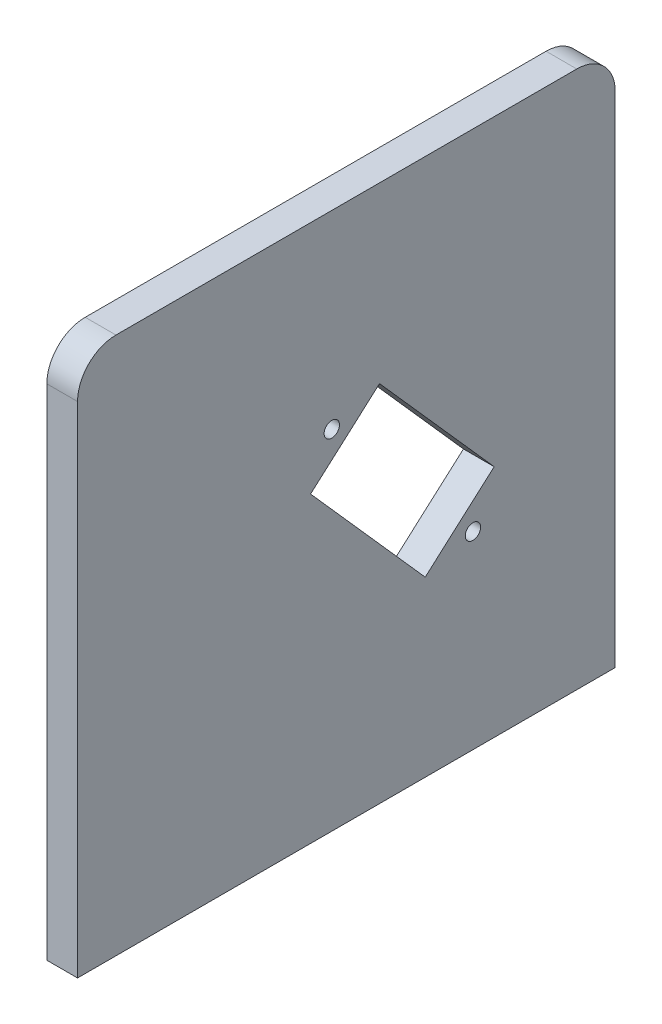
ISO-10303-21;
HEADER;
FILE_DESCRIPTION(('STEP AP214'),'2;1');
FILE_NAME('part.step','',(''),(''),'','','');
FILE_SCHEMA(('AUTOMOTIVE_DESIGN { 1 0 10303 214 1 1 1 1 }'));
ENDSEC;
DATA;
#1=APPLICATION_CONTEXT('core data for automotive mechanical design processes');
#2=APPLICATION_PROTOCOL_DEFINITION('international standard','automotive_design',2000,#1);
#3=PRODUCT_CONTEXT('',#1,'mechanical');
#4=PRODUCT('Part','Part','',(#3));
#5=PRODUCT_RELATED_PRODUCT_CATEGORY('part','',(#4));
#6=PRODUCT_DEFINITION_FORMATION('','',#4);
#7=PRODUCT_DEFINITION_CONTEXT('part definition',#1,'design');
#8=PRODUCT_DEFINITION('design','',#6,#7);
#9=PRODUCT_DEFINITION_SHAPE('','',#8);
#10=(LENGTH_UNIT() NAMED_UNIT(*) SI_UNIT(.MILLI.,.METRE.));
#11=(NAMED_UNIT(*) PLANE_ANGLE_UNIT() SI_UNIT($,.RADIAN.));
#12=(NAMED_UNIT(*) SI_UNIT($,.STERADIAN.) SOLID_ANGLE_UNIT());
#13=UNCERTAINTY_MEASURE_WITH_UNIT(LENGTH_MEASURE(1.E-05),#10,'distance_accuracy_value','');
#14=(GEOMETRIC_REPRESENTATION_CONTEXT(3) GLOBAL_UNCERTAINTY_ASSIGNED_CONTEXT((#13)) GLOBAL_UNIT_ASSIGNED_CONTEXT((#10,
#11,#12)) REPRESENTATION_CONTEXT('',''));
#15=CARTESIAN_POINT('',(0.,0.,0.));
#16=DIRECTION('',(0.,0.,1.));
#17=DIRECTION('',(1.,0.,0.));
#18=AXIS2_PLACEMENT_3D('',#15,#16,#17);
#19=CARTESIAN_POINT('',(0.,0.,0.));
#20=DIRECTION('',(0.,1.,0.));
#21=DIRECTION('',(0.,0.,1.));
#22=AXIS2_PLACEMENT_3D('',#19,#20,#21);
#23=PLANE('',#22);
#24=DIRECTION('',(0.,0.,1.));
#25=VECTOR('',#24,1.);
#26=CARTESIAN_POINT('',(35.2286949676816,0.,0.));
#27=LINE('',#26,#25);
#28=CARTESIAN_POINT('',(35.2286949676816,0.,-39.2125486187539));
#29=VERTEX_POINT('',#28);
#30=CARTESIAN_POINT('',(35.2286949676816,0.,30.7874513812461));
#31=VERTEX_POINT('',#30);
#32=EDGE_CURVE('E156',#29,#31,#27,.T.);
#33=ORIENTED_EDGE('',*,*,#32,.F.);
#34=DIRECTION('',(-1.,0.,0.));
#35=VECTOR('',#34,1.);
#36=CARTESIAN_POINT('',(0.,0.,-39.2125486187539));
#37=LINE('',#36,#35);
#38=CARTESIAN_POINT('',(39.2286949676816,0.,-39.2125486187539));
#39=VERTEX_POINT('',#38);
#40=EDGE_CURVE('E165',#39,#29,#37,.T.);
#41=ORIENTED_EDGE('',*,*,#40,.F.);
#42=DIRECTION('',(0.,0.,1.));
#43=VECTOR('',#42,1.);
#44=CARTESIAN_POINT('',(39.2286949676817,0.,0.));
#45=LINE('',#44,#43);
#46=CARTESIAN_POINT('',(39.2286949676817,0.,30.7874513812461));
#47=VERTEX_POINT('',#46);
#48=EDGE_CURVE('E162',#39,#47,#45,.T.);
#49=ORIENTED_EDGE('',*,*,#48,.T.);
#50=DIRECTION('',(1.,0.,0.));
#51=VECTOR('',#50,1.);
#52=CARTESIAN_POINT('',(0.,0.,30.7874513812461));
#53=LINE('',#52,#51);
#54=EDGE_CURVE('E159',#31,#47,#53,.T.);
#55=ORIENTED_EDGE('',*,*,#54,.F.);
#56=EDGE_LOOP('',(#33,#41,#49,#55));
#57=FACE_BOUND('',#56,.T.);
#58=ADVANCED_FACE('F37',(#57),#23,.F.);
#59=CARTESIAN_POINT('',(0.,3.,30.7874513812461));
#60=DIRECTION('',(0.,0.,-1.));
#61=DIRECTION('',(-1.,0.,0.));
#62=AXIS2_PLACEMENT_3D('',#59,#60,#61);
#63=PLANE('',#62);
#64=DIRECTION('',(0.,-1.,0.));
#65=VECTOR('',#64,1.);
#66=CARTESIAN_POINT('',(39.2286949676817,3.,30.7874513812461));
#67=LINE('',#66,#65);
#68=CARTESIAN_POINT('',(39.2286949676817,65.,30.7874513812461));
#69=VERTEX_POINT('',#68);
#70=EDGE_CURVE('E172',#69,#47,#67,.T.);
#71=ORIENTED_EDGE('',*,*,#70,.F.);
#72=DIRECTION('',(1.,0.,0.));
#73=VECTOR('',#72,1.);
#74=CARTESIAN_POINT('',(35.2286949676816,65.,30.7874513812461));
#75=LINE('',#74,#73);
#76=CARTESIAN_POINT('',(35.2286949676816,65.,30.7874513812461));
#77=VERTEX_POINT('',#76);
#78=EDGE_CURVE('E11',#69,#77,#75,.F.);
#79=ORIENTED_EDGE('',*,*,#78,.T.);
#80=DIRECTION('',(0.,-1.,0.));
#81=VECTOR('',#80,1.);
#82=CARTESIAN_POINT('',(35.2286949676816,3.,30.7874513812461));
#83=LINE('',#82,#81);
#84=EDGE_CURVE('E174',#77,#31,#83,.T.);
#85=ORIENTED_EDGE('',*,*,#84,.T.);
#86=ORIENTED_EDGE('',*,*,#54,.T.);
#87=EDGE_LOOP('',(#71,#79,#85,#86));
#88=FACE_BOUND('',#87,.T.);
#89=ADVANCED_FACE('F217',(#88),#63,.F.);
#90=CARTESIAN_POINT('',(0.,65.,25.7874513812461));
#91=DIRECTION('',(-1.,0.,0.));
#92=DIRECTION('',(0.,0.,1.));
#93=AXIS2_PLACEMENT_3D('',#90,#91,#92);
#94=CYLINDRICAL_SURFACE('',#93,5.);
#95=CARTESIAN_POINT('',(35.2286949676816,65.,25.7874513812461));
#96=DIRECTION('',(1.,0.,0.));
#97=DIRECTION('',(0.,0.,-1.));
#98=AXIS2_PLACEMENT_3D('',#95,#96,#97);
#99=CIRCLE('',#98,5.);
#100=CARTESIAN_POINT('',(35.2286949676816,70.,25.7874513812461));
#101=VERTEX_POINT('',#100);
#102=EDGE_CURVE('E182',#77,#101,#99,.F.);
#103=ORIENTED_EDGE('',*,*,#102,.F.);
#104=ORIENTED_EDGE('',*,*,#78,.F.);
#105=CARTESIAN_POINT('',(39.2286949676817,65.,25.7874513812461));
#106=DIRECTION('',(1.,0.,0.));
#107=DIRECTION('',(0.,0.,-1.));
#108=AXIS2_PLACEMENT_3D('',#105,#106,#107);
#109=CIRCLE('',#108,5.);
#110=CARTESIAN_POINT('',(39.2286949676817,70.,25.7874513812461));
#111=VERTEX_POINT('',#110);
#112=EDGE_CURVE('E188',#111,#69,#109,.T.);
#113=ORIENTED_EDGE('',*,*,#112,.F.);
#114=DIRECTION('',(1.,0.,0.));
#115=VECTOR('',#114,1.);
#116=CARTESIAN_POINT('',(39.2286949676817,70.,25.7874513812461));
#117=LINE('',#116,#115);
#118=EDGE_CURVE('E176',#101,#111,#117,.T.);
#119=ORIENTED_EDGE('',*,*,#118,.F.);
#120=EDGE_LOOP('',(#103,#104,#113,#119));
#121=FACE_BOUND('',#120,.T.);
#122=ADVANCED_FACE('F39',(#121),#94,.T.);
#123=CARTESIAN_POINT('',(0.,70.,0.));
#124=DIRECTION('',(0.,1.,0.));
#125=DIRECTION('',(0.,0.,1.));
#126=AXIS2_PLACEMENT_3D('',#123,#124,#125);
#127=PLANE('',#126);
#128=DIRECTION('',(0.,0.,1.));
#129=VECTOR('',#128,1.);
#130=CARTESIAN_POINT('',(39.2286949676816,70.,-39.2125486187539));
#131=LINE('',#130,#129);
#132=CARTESIAN_POINT('',(39.2286949676816,70.,-34.2125486187539));
#133=VERTEX_POINT('',#132);
#134=EDGE_CURVE('E153',#133,#111,#131,.T.);
#135=ORIENTED_EDGE('',*,*,#134,.F.);
#136=DIRECTION('',(-1.,0.,0.));
#137=VECTOR('',#136,1.);
#138=CARTESIAN_POINT('',(35.2286949676816,70.,-34.2125486187539));
#139=LINE('',#138,#137);
#140=CARTESIAN_POINT('',(35.2286949676816,70.,-34.2125486187539));
#141=VERTEX_POINT('',#140);
#142=EDGE_CURVE('E179',#133,#141,#139,.T.);
#143=ORIENTED_EDGE('',*,*,#142,.T.);
#144=DIRECTION('',(0.,0.,1.));
#145=VECTOR('',#144,1.);
#146=CARTESIAN_POINT('',(35.2286949676816,70.,-39.2125486187539));
#147=LINE('',#146,#145);
#148=EDGE_CURVE('E150',#141,#101,#147,.T.);
#149=ORIENTED_EDGE('',*,*,#148,.T.);
#150=ORIENTED_EDGE('',*,*,#118,.T.);
#151=EDGE_LOOP('',(#135,#143,#149,#150));
#152=FACE_BOUND('',#151,.T.);
#153=ADVANCED_FACE('F198',(#152),#127,.T.);
#154=CARTESIAN_POINT('',(0.,65.,-34.2125486187539));
#155=DIRECTION('',(1.,0.,0.));
#156=DIRECTION('',(0.,0.,-1.));
#157=AXIS2_PLACEMENT_3D('',#154,#155,#156);
#158=CYLINDRICAL_SURFACE('',#157,5.);
#159=CARTESIAN_POINT('',(39.2286949676817,65.,-34.2125486187539));
#160=DIRECTION('',(1.,0.,0.));
#161=DIRECTION('',(0.,0.,-1.));
#162=AXIS2_PLACEMENT_3D('',#159,#160,#161);
#163=CIRCLE('',#162,5.);
#164=CARTESIAN_POINT('',(39.2286949676816,65.,-39.2125486187539));
#165=VERTEX_POINT('',#164);
#166=EDGE_CURVE('E45',#165,#133,#163,.T.);
#167=ORIENTED_EDGE('',*,*,#166,.F.);
#168=DIRECTION('',(-1.,0.,0.));
#169=VECTOR('',#168,1.);
#170=CARTESIAN_POINT('',(39.2286949676816,65.,-39.2125486187539));
#171=LINE('',#170,#169);
#172=CARTESIAN_POINT('',(35.2286949676816,65.,-39.2125486187539));
#173=VERTEX_POINT('',#172);
#174=EDGE_CURVE('E186',#173,#165,#171,.F.);
#175=ORIENTED_EDGE('',*,*,#174,.F.);
#176=CARTESIAN_POINT('',(35.2286949676816,65.,-34.2125486187539));
#177=DIRECTION('',(1.,0.,0.));
#178=DIRECTION('',(0.,0.,-1.));
#179=AXIS2_PLACEMENT_3D('',#176,#177,#178);
#180=CIRCLE('',#179,5.);
#181=EDGE_CURVE('E184',#141,#173,#180,.F.);
#182=ORIENTED_EDGE('',*,*,#181,.F.);
#183=ORIENTED_EDGE('',*,*,#142,.F.);
#184=EDGE_LOOP('',(#167,#175,#182,#183));
#185=FACE_BOUND('',#184,.T.);
#186=ADVANCED_FACE('F201',(#185),#158,.T.);
#187=CARTESIAN_POINT('',(35.2286949676816,3.,0.));
#188=DIRECTION('',(1.,0.,0.));
#189=DIRECTION('',(0.,0.,-1.));
#190=AXIS2_PLACEMENT_3D('',#187,#188,#189);
#191=PLANE('',#190);
#192=DIRECTION('',(0.,0.748222181604417,0.66344823984628));
#193=VECTOR('',#192,1.);
#194=CARTESIAN_POINT('',(35.2286949676816,22.567537757754,-14.4782904579659));
#195=LINE('',#194,#193);
#196=CARTESIAN_POINT('',(35.2286949676816,22.567537757754,-14.4782904579659));
#197=VERTEX_POINT('',#196);
#198=CARTESIAN_POINT('',(35.2286949676816,39.4025368438534,0.449294938575429));
#199=VERTEX_POINT('',#198);
#200=EDGE_CURVE('E361',#197,#199,#195,.T.);
#201=ORIENTED_EDGE('',*,*,#200,.F.);
#202=DIRECTION('',(0.,-0.663448239846281,0.748222181604416));
#203=VECTOR('',#202,1.);
#204=CARTESIAN_POINT('',(35.2286949676816,30.5289166359094,-23.4569566372189));
#205=LINE('',#204,#203);
#206=CARTESIAN_POINT('',(35.2286949676816,30.5289166359094,-23.4569566372189));
#207=VERTEX_POINT('',#206);
#208=EDGE_CURVE('E119',#207,#197,#205,.T.);
#209=ORIENTED_EDGE('',*,*,#208,.F.);
#210=DIRECTION('',(0.,-0.748222181604416,-0.663448239846281));
#211=VECTOR('',#210,1.);
#212=CARTESIAN_POINT('',(35.2286949676816,47.3639157220088,-8.52937124067757));
#213=LINE('',#212,#211);
#214=CARTESIAN_POINT('',(35.2286949676816,47.3639157220088,-8.52937124067757));
#215=VERTEX_POINT('',#214);
#216=EDGE_CURVE('E140',#215,#207,#213,.T.);
#217=ORIENTED_EDGE('',*,*,#216,.F.);
#218=DIRECTION('',(0.,0.66344823984628,-0.748222181604417));
#219=VECTOR('',#218,1.);
#220=CARTESIAN_POINT('',(35.2286949676816,39.4025368438534,0.449294938575427));
#221=LINE('',#220,#219);
#222=EDGE_CURVE('E358',#199,#215,#221,.T.);
#223=ORIENTED_EDGE('',*,*,#222,.F.);
#224=EDGE_LOOP('',(#201,#209,#217,#223));
#225=FACE_BOUND('',#224,.T.);
#226=CARTESIAN_POINT('',(35.2286949676816,24.6028495246602,-20.6925889711927));
#227=DIRECTION('',(1.,0.,0.));
#228=DIRECTION('',(0.,0.,-1.));
#229=AXIS2_PLACEMENT_3D('',#226,#227,#228);
#230=CIRCLE('',#229,1.);
#231=CARTESIAN_POINT('',(35.2286949676816,24.6028495246602,-21.6925889711927));
#232=VERTEX_POINT('',#231);
#233=EDGE_CURVE('E128',#232,#232,#230,.F.);
#234=ORIENTED_EDGE('',*,*,#233,.F.);
#235=EDGE_LOOP('',(#234));
#236=FACE_BOUND('',#235,.T.);
#237=CARTESIAN_POINT('',(35.2286949676816,45.3286039551026,-2.31507272745074));
#238=DIRECTION('',(1.,0.,0.));
#239=DIRECTION('',(0.,0.,-1.));
#240=AXIS2_PLACEMENT_3D('',#237,#238,#239);
#241=CIRCLE('',#240,1.);
#242=CARTESIAN_POINT('',(35.2286949676816,45.3286039551026,-3.31507272745074));
#243=VERTEX_POINT('',#242);
#244=EDGE_CURVE('E147',#243,#243,#241,.F.);
#245=ORIENTED_EDGE('',*,*,#244,.F.);
#246=EDGE_LOOP('',(#245));
#247=FACE_BOUND('',#246,.T.);
#248=ORIENTED_EDGE('',*,*,#148,.F.);
#249=ORIENTED_EDGE('',*,*,#181,.T.);
#250=DIRECTION('',(0.,-1.,0.));
#251=VECTOR('',#250,1.);
#252=CARTESIAN_POINT('',(35.2286949676816,3.,-39.2125486187539));
#253=LINE('',#252,#251);
#254=EDGE_CURVE('E168',#173,#29,#253,.T.);
#255=ORIENTED_EDGE('',*,*,#254,.T.);
#256=ORIENTED_EDGE('',*,*,#32,.T.);
#257=ORIENTED_EDGE('',*,*,#84,.F.);
#258=ORIENTED_EDGE('',*,*,#102,.T.);
#259=EDGE_LOOP('',(#248,#249,#255,#256,#257,#258));
#260=FACE_BOUND('',#259,.T.);
#261=ADVANCED_FACE('F204',(#225,#236,#247,#260),#191,.F.);
#262=CARTESIAN_POINT('',(0.,3.,-39.2125486187539));
#263=DIRECTION('',(0.,0.,1.));
#264=DIRECTION('',(1.,0.,0.));
#265=AXIS2_PLACEMENT_3D('',#262,#263,#264);
#266=PLANE('',#265);
#267=ORIENTED_EDGE('',*,*,#254,.F.);
#268=ORIENTED_EDGE('',*,*,#174,.T.);
#269=DIRECTION('',(0.,-1.,0.));
#270=VECTOR('',#269,1.);
#271=CARTESIAN_POINT('',(39.2286949676816,3.,-39.2125486187539));
#272=LINE('',#271,#270);
#273=EDGE_CURVE('E170',#165,#39,#272,.T.);
#274=ORIENTED_EDGE('',*,*,#273,.T.);
#275=ORIENTED_EDGE('',*,*,#40,.T.);
#276=EDGE_LOOP('',(#267,#268,#274,#275));
#277=FACE_BOUND('',#276,.T.);
#278=ADVANCED_FACE('F206',(#277),#266,.F.);
#279=CARTESIAN_POINT('',(39.2286949676817,3.,0.));
#280=DIRECTION('',(1.,0.,0.));
#281=DIRECTION('',(0.,0.,-1.));
#282=AXIS2_PLACEMENT_3D('',#279,#280,#281);
#283=PLANE('',#282);
#284=DIRECTION('',(0.,0.663448239846281,-0.748222181604416));
#285=VECTOR('',#284,1.);
#286=CARTESIAN_POINT('',(39.2286949676817,30.5289166359094,-23.4569566372189));
#287=LINE('',#286,#285);
#288=CARTESIAN_POINT('',(39.2286949676817,22.567537757754,-14.4782904579659));
#289=VERTEX_POINT('',#288);
#290=CARTESIAN_POINT('',(39.2286949676817,30.5289166359094,-23.4569566372189));
#291=VERTEX_POINT('',#290);
#292=EDGE_CURVE('E116',#289,#291,#287,.T.);
#293=ORIENTED_EDGE('',*,*,#292,.F.);
#294=DIRECTION('',(0.,-0.748222181604417,-0.66344823984628));
#295=VECTOR('',#294,1.);
#296=CARTESIAN_POINT('',(39.2286949676817,22.567537757754,-14.4782904579659));
#297=LINE('',#296,#295);
#298=CARTESIAN_POINT('',(39.2286949676817,39.4025368438534,0.449294938575432));
#299=VERTEX_POINT('',#298);
#300=EDGE_CURVE('E124',#299,#289,#297,.T.);
#301=ORIENTED_EDGE('',*,*,#300,.F.);
#302=DIRECTION('',(0.,-0.66344823984628,0.748222181604417));
#303=VECTOR('',#302,1.);
#304=CARTESIAN_POINT('',(39.2286949676817,39.4025368438534,0.449294938575429));
#305=LINE('',#304,#303);
#306=CARTESIAN_POINT('',(39.2286949676817,47.3639157220088,-8.52937124067757));
#307=VERTEX_POINT('',#306);
#308=EDGE_CURVE('E60',#307,#299,#305,.T.);
#309=ORIENTED_EDGE('',*,*,#308,.F.);
#310=DIRECTION('',(0.,0.748222181604416,0.663448239846281));
#311=VECTOR('',#310,1.);
#312=CARTESIAN_POINT('',(39.2286949676817,47.3639157220088,-8.52937124067757));
#313=LINE('',#312,#311);
#314=EDGE_CURVE('E133',#291,#307,#313,.T.);
#315=ORIENTED_EDGE('',*,*,#314,.F.);
#316=EDGE_LOOP('',(#293,#301,#309,#315));
#317=FACE_BOUND('',#316,.T.);
#318=CARTESIAN_POINT('',(39.2286949676817,24.6028495246602,-20.6925889711927));
#319=DIRECTION('',(1.,0.,0.));
#320=DIRECTION('',(0.,0.,-1.));
#321=AXIS2_PLACEMENT_3D('',#318,#319,#320);
#322=CIRCLE('',#321,1.);
#323=CARTESIAN_POINT('',(39.2286949676817,24.6028495246602,-21.6925889711927));
#324=VERTEX_POINT('',#323);
#325=EDGE_CURVE('E366',#324,#324,#322,.T.);
#326=ORIENTED_EDGE('',*,*,#325,.F.);
#327=EDGE_LOOP('',(#326));
#328=FACE_BOUND('',#327,.T.);
#329=CARTESIAN_POINT('',(39.2286949676817,45.3286039551026,-2.31507272745074));
#330=DIRECTION('',(1.,0.,0.));
#331=DIRECTION('',(0.,0.,-1.));
#332=AXIS2_PLACEMENT_3D('',#329,#330,#331);
#333=CIRCLE('',#332,1.);
#334=CARTESIAN_POINT('',(39.2286949676817,45.3286039551026,-3.31507272745074));
#335=VERTEX_POINT('',#334);
#336=EDGE_CURVE('E144',#335,#335,#333,.T.);
#337=ORIENTED_EDGE('',*,*,#336,.F.);
#338=EDGE_LOOP('',(#337));
#339=FACE_BOUND('',#338,.T.);
#340=ORIENTED_EDGE('',*,*,#273,.F.);
#341=ORIENTED_EDGE('',*,*,#166,.T.);
#342=ORIENTED_EDGE('',*,*,#134,.T.);
#343=ORIENTED_EDGE('',*,*,#112,.T.);
#344=ORIENTED_EDGE('',*,*,#70,.T.);
#345=ORIENTED_EDGE('',*,*,#48,.F.);
#346=EDGE_LOOP('',(#340,#341,#342,#343,#344,#345));
#347=FACE_BOUND('',#346,.T.);
#348=ADVANCED_FACE('F130',(#317,#328,#339,#347),#283,.T.);
#349=CARTESIAN_POINT('',(0.784984009781858,45.3286039551026,-2.31507272745074));
#350=DIRECTION('',(1.,0.,0.));
#351=DIRECTION('',(0.,0.,-1.));
#352=AXIS2_PLACEMENT_3D('',#349,#350,#351);
#353=CYLINDRICAL_SURFACE('',#352,1.);
#354=ORIENTED_EDGE('',*,*,#244,.T.);
#355=EDGE_LOOP('',(#354));
#356=FACE_BOUND('',#355,.T.);
#357=ORIENTED_EDGE('',*,*,#336,.T.);
#358=EDGE_LOOP('',(#357));
#359=FACE_BOUND('',#358,.T.);
#360=ADVANCED_FACE('F238',(#356,#359),#353,.F.);
#361=CARTESIAN_POINT('',(0.784984009781858,24.6028495246602,-20.6925889711927));
#362=DIRECTION('',(1.,0.,0.));
#363=DIRECTION('',(0.,0.,-1.));
#364=AXIS2_PLACEMENT_3D('',#361,#362,#363);
#365=CYLINDRICAL_SURFACE('',#364,1.);
#366=ORIENTED_EDGE('',*,*,#233,.T.);
#367=EDGE_LOOP('',(#366));
#368=FACE_BOUND('',#367,.T.);
#369=ORIENTED_EDGE('',*,*,#325,.T.);
#370=EDGE_LOOP('',(#369));
#371=FACE_BOUND('',#370,.T.);
#372=ADVANCED_FACE('F247',(#368,#371),#365,.F.);
#373=CARTESIAN_POINT('',(0.784984009781858,30.5289166359094,-23.4569566372189));
#374=DIRECTION('',(0.,-0.748222181604416,-0.663448239846281));
#375=DIRECTION('',(0.,0.663448239846281,-0.748222181604416));
#376=AXIS2_PLACEMENT_3D('',#373,#374,#375);
#377=PLANE('',#376);
#378=ORIENTED_EDGE('',*,*,#208,.T.);
#379=DIRECTION('',(1.,0.,0.));
#380=VECTOR('',#379,1.);
#381=CARTESIAN_POINT('',(0.784984009781858,22.567537757754,-14.4782904579659));
#382=LINE('',#381,#380);
#383=EDGE_CURVE('E52',#197,#289,#382,.T.);
#384=ORIENTED_EDGE('',*,*,#383,.T.);
#385=ORIENTED_EDGE('',*,*,#292,.T.);
#386=DIRECTION('',(1.,0.,0.));
#387=VECTOR('',#386,1.);
#388=CARTESIAN_POINT('',(0.784984009781858,30.5289166359094,-23.4569566372189));
#389=LINE('',#388,#387);
#390=EDGE_CURVE('E121',#207,#291,#389,.T.);
#391=ORIENTED_EDGE('',*,*,#390,.F.);
#392=EDGE_LOOP('',(#378,#384,#385,#391));
#393=FACE_BOUND('',#392,.T.);
#394=ADVANCED_FACE('F113',(#393),#377,.F.);
#395=CARTESIAN_POINT('',(0.784984009781858,47.3639157220088,-8.52937124067757));
#396=DIRECTION('',(0.,0.663448239846281,-0.748222181604416));
#397=DIRECTION('',(0.,0.748222181604416,0.663448239846281));
#398=AXIS2_PLACEMENT_3D('',#395,#396,#397);
#399=PLANE('',#398);
#400=ORIENTED_EDGE('',*,*,#216,.T.);
#401=ORIENTED_EDGE('',*,*,#390,.T.);
#402=ORIENTED_EDGE('',*,*,#314,.T.);
#403=DIRECTION('',(1.,0.,0.));
#404=VECTOR('',#403,1.);
#405=CARTESIAN_POINT('',(0.784984009781858,47.3639157220088,-8.52937124067757));
#406=LINE('',#405,#404);
#407=EDGE_CURVE('E141',#215,#307,#406,.T.);
#408=ORIENTED_EDGE('',*,*,#407,.F.);
#409=EDGE_LOOP('',(#400,#401,#402,#408));
#410=FACE_BOUND('',#409,.T.);
#411=ADVANCED_FACE('F262',(#410),#399,.F.);
#412=CARTESIAN_POINT('',(0.784984009781858,39.4025368438534,0.449294938575429));
#413=DIRECTION('',(0.,0.748222181604417,0.66344823984628));
#414=DIRECTION('',(0.,-0.66344823984628,0.748222181604417));
#415=AXIS2_PLACEMENT_3D('',#412,#413,#414);
#416=PLANE('',#415);
#417=ORIENTED_EDGE('',*,*,#222,.T.);
#418=ORIENTED_EDGE('',*,*,#407,.T.);
#419=ORIENTED_EDGE('',*,*,#308,.T.);
#420=DIRECTION('',(1.,0.,0.));
#421=VECTOR('',#420,1.);
#422=CARTESIAN_POINT('',(0.784984009781858,39.4025368438534,0.449294938575429));
#423=LINE('',#422,#421);
#424=EDGE_CURVE('E126',#199,#299,#423,.T.);
#425=ORIENTED_EDGE('',*,*,#424,.F.);
#426=EDGE_LOOP('',(#417,#418,#419,#425));
#427=FACE_BOUND('',#426,.T.);
#428=ADVANCED_FACE('F267',(#427),#416,.F.);
#429=CARTESIAN_POINT('',(0.784984009781858,22.567537757754,-14.4782904579659));
#430=DIRECTION('',(0.,-0.66344823984628,0.748222181604417));
#431=DIRECTION('',(0.,-0.748222181604417,-0.66344823984628));
#432=AXIS2_PLACEMENT_3D('',#429,#430,#431);
#433=PLANE('',#432);
#434=ORIENTED_EDGE('',*,*,#200,.T.);
#435=ORIENTED_EDGE('',*,*,#424,.T.);
#436=ORIENTED_EDGE('',*,*,#300,.T.);
#437=ORIENTED_EDGE('',*,*,#383,.F.);
#438=EDGE_LOOP('',(#434,#435,#436,#437));
#439=FACE_BOUND('',#438,.T.);
#440=ADVANCED_FACE('F125',(#439),#433,.F.);
#441=CLOSED_SHELL('',(#58,#89,#122,#153,#186,#261,#278,#348,#360,#372,#394,#411,#428,#440));
#442=MANIFOLD_SOLID_BREP('B2',#441);
#443=ADVANCED_BREP_SHAPE_REPRESENTATION('',(#18,#442),#14);
#444=SHAPE_DEFINITION_REPRESENTATION(#9,#443);
ENDSEC;
END-ISO-10303-21;
